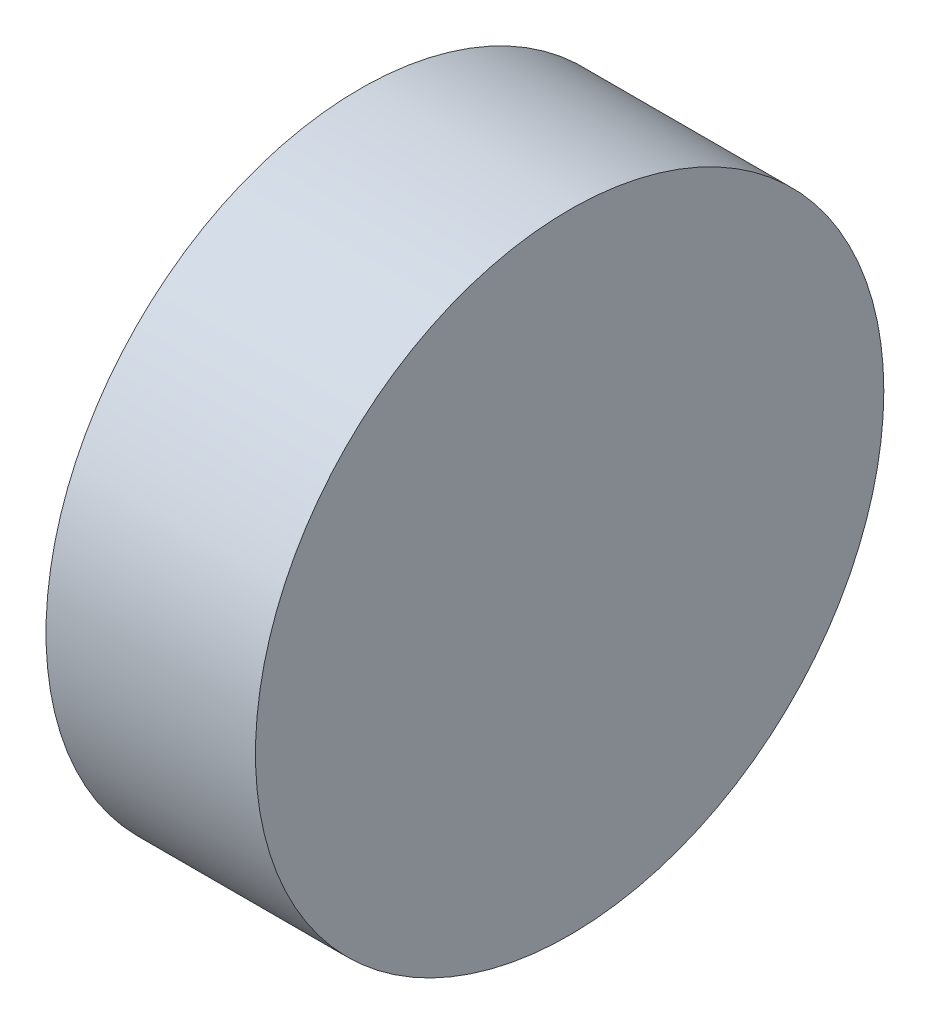
ISO-10303-21;
HEADER;
FILE_DESCRIPTION(('STEP AP214'),'2;1');
FILE_NAME('part.step','',(''),(''),'','','');
FILE_SCHEMA(('AUTOMOTIVE_DESIGN { 1 0 10303 214 1 1 1 1 }'));
ENDSEC;
DATA;
#1=APPLICATION_CONTEXT('core data for automotive mechanical design processes');
#2=APPLICATION_PROTOCOL_DEFINITION('international standard','automotive_design',2000,#1);
#3=PRODUCT_CONTEXT('',#1,'mechanical');
#4=PRODUCT('Part','Part','',(#3));
#5=PRODUCT_RELATED_PRODUCT_CATEGORY('part','',(#4));
#6=PRODUCT_DEFINITION_FORMATION('','',#4);
#7=PRODUCT_DEFINITION_CONTEXT('part definition',#1,'design');
#8=PRODUCT_DEFINITION('design','',#6,#7);
#9=PRODUCT_DEFINITION_SHAPE('','',#8);
#10=(LENGTH_UNIT() NAMED_UNIT(*) SI_UNIT(.MILLI.,.METRE.));
#11=(NAMED_UNIT(*) PLANE_ANGLE_UNIT() SI_UNIT($,.RADIAN.));
#12=(NAMED_UNIT(*) SI_UNIT($,.STERADIAN.) SOLID_ANGLE_UNIT());
#13=UNCERTAINTY_MEASURE_WITH_UNIT(LENGTH_MEASURE(1.E-05),#10,'distance_accuracy_value','');
#14=(GEOMETRIC_REPRESENTATION_CONTEXT(3) GLOBAL_UNCERTAINTY_ASSIGNED_CONTEXT((#13)) GLOBAL_UNIT_ASSIGNED_CONTEXT((#10,
#11,#12)) REPRESENTATION_CONTEXT('',''));
#15=CARTESIAN_POINT('',(0.,0.,0.));
#16=DIRECTION('',(0.,0.,1.));
#17=DIRECTION('',(1.,0.,0.));
#18=AXIS2_PLACEMENT_3D('',#15,#16,#17);
#19=CARTESIAN_POINT('',(100.,0.,0.));
#20=DIRECTION('',(-1.,0.,0.));
#21=DIRECTION('',(0.,0.,1.));
#22=AXIS2_PLACEMENT_3D('',#19,#20,#21);
#23=CYLINDRICAL_SURFACE('',#22,150.);
#24=CARTESIAN_POINT('',(100.,0.,0.));
#25=DIRECTION('',(1.,0.,0.));
#26=DIRECTION('',(0.,0.,-1.));
#27=AXIS2_PLACEMENT_3D('',#24,#25,#26);
#28=CIRCLE('',#27,150.);
#29=CARTESIAN_POINT('',(100.,0.,-150.));
#30=VERTEX_POINT('',#29);
#31=EDGE_CURVE('E10',#30,#30,#28,.T.);
#32=ORIENTED_EDGE('',*,*,#31,.F.);
#33=EDGE_LOOP('',(#32));
#34=FACE_BOUND('',#33,.T.);
#35=CARTESIAN_POINT('',(0.,0.,0.));
#36=DIRECTION('',(1.,0.,0.));
#37=DIRECTION('',(0.,0.,-1.));
#38=AXIS2_PLACEMENT_3D('',#35,#36,#37);
#39=CIRCLE('',#38,150.);
#40=CARTESIAN_POINT('',(0.,0.,-150.));
#41=VERTEX_POINT('',#40);
#42=EDGE_CURVE('E40',#41,#41,#39,.T.);
#43=ORIENTED_EDGE('',*,*,#42,.T.);
#44=EDGE_LOOP('',(#43));
#45=FACE_BOUND('',#44,.T.);
#46=ADVANCED_FACE('F37',(#34,#45),#23,.T.);
#47=CARTESIAN_POINT('',(100.,0.,0.));
#48=DIRECTION('',(1.,0.,0.));
#49=DIRECTION('',(0.,0.,-1.));
#50=AXIS2_PLACEMENT_3D('',#47,#48,#49);
#51=PLANE('',#50);
#52=ORIENTED_EDGE('',*,*,#31,.T.);
#53=EDGE_LOOP('',(#52));
#54=FACE_BOUND('',#53,.T.);
#55=ADVANCED_FACE('F52',(#54),#51,.T.);
#56=CARTESIAN_POINT('',(0.,0.,0.));
#57=DIRECTION('',(1.,0.,0.));
#58=DIRECTION('',(0.,0.,-1.));
#59=AXIS2_PLACEMENT_3D('',#56,#57,#58);
#60=PLANE('',#59);
#61=ORIENTED_EDGE('',*,*,#42,.F.);
#62=EDGE_LOOP('',(#61));
#63=FACE_BOUND('',#62,.T.);
#64=ADVANCED_FACE('F50',(#63),#60,.F.);
#65=CLOSED_SHELL('',(#46,#55,#64));
#66=MANIFOLD_SOLID_BREP('B2',#65);
#67=ADVANCED_BREP_SHAPE_REPRESENTATION('',(#18,#66),#14);
#68=SHAPE_DEFINITION_REPRESENTATION(#9,#67);
ENDSEC;
END-ISO-10303-21;
